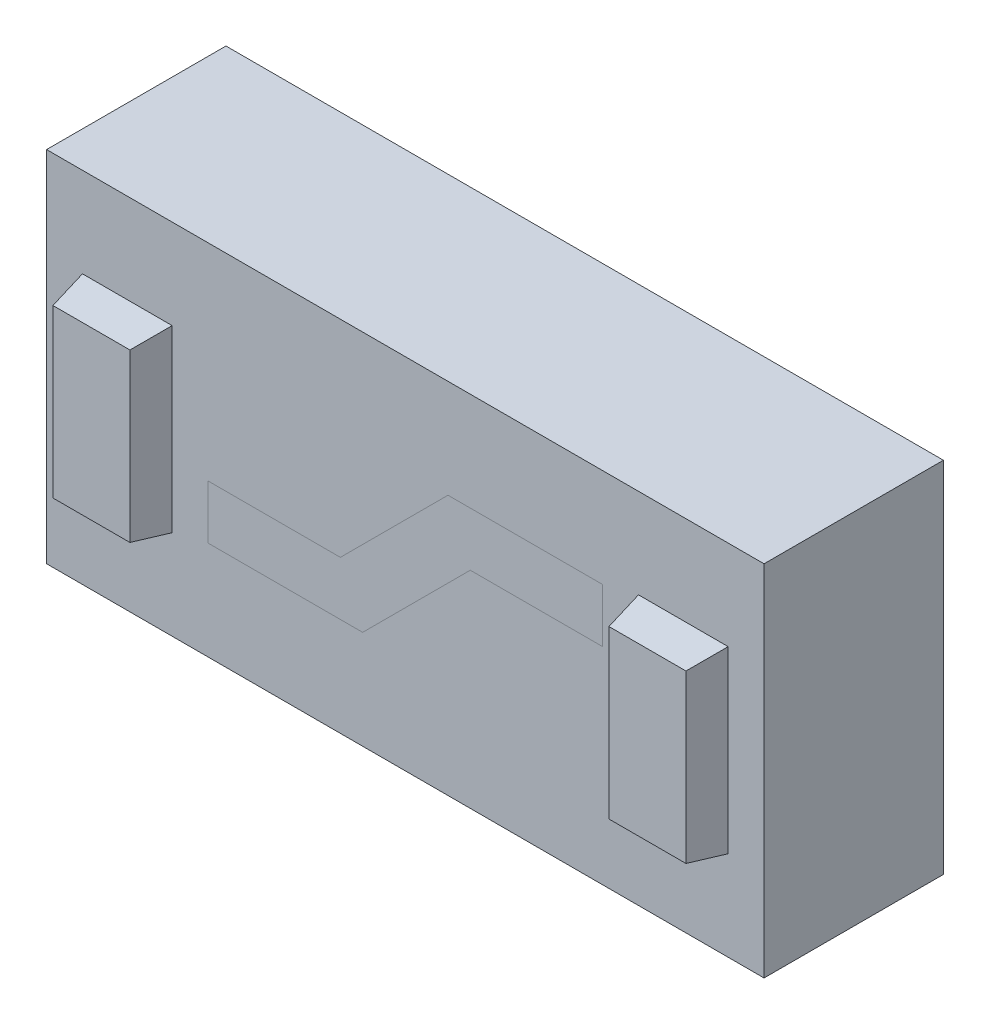
ISO-10303-21;
HEADER;
FILE_DESCRIPTION(('STEP AP214'),'2;1');
FILE_NAME('part.step','',(''),(''),'','','');
FILE_SCHEMA(('AUTOMOTIVE_DESIGN { 1 0 10303 214 1 1 1 1 }'));
ENDSEC;
DATA;
#1=APPLICATION_CONTEXT('core data for automotive mechanical design processes');
#2=APPLICATION_PROTOCOL_DEFINITION('international standard','automotive_design',2000,#1);
#3=PRODUCT_CONTEXT('',#1,'mechanical');
#4=PRODUCT('Part','Part','',(#3));
#5=PRODUCT_RELATED_PRODUCT_CATEGORY('part','',(#4));
#6=PRODUCT_DEFINITION_FORMATION('','',#4);
#7=PRODUCT_DEFINITION_CONTEXT('part definition',#1,'design');
#8=PRODUCT_DEFINITION('design','',#6,#7);
#9=PRODUCT_DEFINITION_SHAPE('','',#8);
#10=(LENGTH_UNIT() NAMED_UNIT(*) SI_UNIT(.MILLI.,.METRE.));
#11=(NAMED_UNIT(*) PLANE_ANGLE_UNIT() SI_UNIT($,.RADIAN.));
#12=(NAMED_UNIT(*) SI_UNIT($,.STERADIAN.) SOLID_ANGLE_UNIT());
#13=UNCERTAINTY_MEASURE_WITH_UNIT(LENGTH_MEASURE(1.E-05),#10,'distance_accuracy_value','');
#14=(GEOMETRIC_REPRESENTATION_CONTEXT(3) GLOBAL_UNCERTAINTY_ASSIGNED_CONTEXT((#13)) GLOBAL_UNIT_ASSIGNED_CONTEXT((#10,
#11,#12)) REPRESENTATION_CONTEXT('',''));
#15=CARTESIAN_POINT('',(0.,0.,0.));
#16=DIRECTION('',(0.,0.,1.));
#17=DIRECTION('',(1.,0.,0.));
#18=AXIS2_PLACEMENT_3D('',#15,#16,#17);
#19=CARTESIAN_POINT('',(18.,-5.,10.));
#20=DIRECTION('',(0.984807753012208,0.,0.17364817766693));
#21=DIRECTION('',(0.17364817766693,0.,-0.984807753012208));
#22=AXIS2_PLACEMENT_3D('',#19,#20,#21);
#23=PLANE('',#22);
#24=DIRECTION('',(0.,1.,0.));
#25=VECTOR('',#24,1.);
#26=CARTESIAN_POINT('',(18.,-5.,10.));
#27=LINE('',#26,#25);
#28=CARTESIAN_POINT('',(18.,-5.,10.));
#29=VERTEX_POINT('',#28);
#30=CARTESIAN_POINT('',(18.,5.,10.));
#31=VERTEX_POINT('',#30);
#32=EDGE_CURVE('E12',#29,#31,#27,.T.);
#33=ORIENTED_EDGE('',*,*,#32,.T.);
#34=DIRECTION('',(0.171087869746036,0.171087869746036,-0.970287525247814));
#35=VECTOR('',#34,1.);
#36=CARTESIAN_POINT('',(17.8536447041288,4.85364470412882,10.830022128679));
#37=LINE('',#36,#35);
#38=CARTESIAN_POINT('',(17.6473460385831,4.64734603858307,12.));
#39=VERTEX_POINT('',#38);
#40=EDGE_CURVE('E115',#39,#31,#37,.T.);
#41=ORIENTED_EDGE('',*,*,#40,.F.);
#42=DIRECTION('',(0.,-1.,0.));
#43=VECTOR('',#42,1.);
#44=CARTESIAN_POINT('',(17.6473460385831,0.,12.));
#45=LINE('',#44,#43);
#46=CARTESIAN_POINT('',(17.6473460385831,-4.64734603858307,12.));
#47=VERTEX_POINT('',#46);
#48=EDGE_CURVE('E99',#47,#39,#45,.F.);
#49=ORIENTED_EDGE('',*,*,#48,.F.);
#50=DIRECTION('',(0.171087869746036,-0.171087869746036,-0.970287525247814));
#51=VECTOR('',#50,1.);
#52=CARTESIAN_POINT('',(18.,-5.,10.));
#53=LINE('',#52,#51);
#54=EDGE_CURVE('E106',#47,#29,#53,.T.);
#55=ORIENTED_EDGE('',*,*,#54,.T.);
#56=EDGE_LOOP('',(#33,#41,#49,#55));
#57=FACE_BOUND('',#56,.T.);
#58=ADVANCED_FACE('F56',(#57),#23,.T.);
#59=CARTESIAN_POINT('',(13.,5.,10.));
#60=DIRECTION('',(0.,0.984807753012208,0.17364817766693));
#61=DIRECTION('',(0.,-0.17364817766693,0.984807753012208));
#62=AXIS2_PLACEMENT_3D('',#59,#60,#61);
#63=PLANE('',#62);
#64=DIRECTION('',(-1.,0.,0.));
#65=VECTOR('',#64,1.);
#66=CARTESIAN_POINT('',(13.,5.,10.));
#67=LINE('',#66,#65);
#68=CARTESIAN_POINT('',(13.,5.,10.));
#69=VERTEX_POINT('',#68);
#70=EDGE_CURVE('E64',#31,#69,#67,.T.);
#71=ORIENTED_EDGE('',*,*,#70,.T.);
#72=DIRECTION('',(-0.171087869746036,0.171087869746036,-0.970287525247814));
#73=VECTOR('',#72,1.);
#74=CARTESIAN_POINT('',(13.2927105917424,4.70728940825764,11.660044257358));
#75=LINE('',#74,#73);
#76=CARTESIAN_POINT('',(13.3526539614169,4.64734603858307,12.));
#77=VERTEX_POINT('',#76);
#78=EDGE_CURVE('E123',#77,#69,#75,.T.);
#79=ORIENTED_EDGE('',*,*,#78,.F.);
#80=DIRECTION('',(1.,0.,0.));
#81=VECTOR('',#80,1.);
#82=CARTESIAN_POINT('',(0.,4.64734603858307,12.));
#83=LINE('',#82,#81);
#84=EDGE_CURVE('E116',#39,#77,#83,.F.);
#85=ORIENTED_EDGE('',*,*,#84,.F.);
#86=ORIENTED_EDGE('',*,*,#40,.T.);
#87=EDGE_LOOP('',(#71,#79,#85,#86));
#88=FACE_BOUND('',#87,.T.);
#89=ADVANCED_FACE('F136',(#88),#63,.T.);
#90=CARTESIAN_POINT('',(13.,-5.,10.));
#91=DIRECTION('',(-0.984807753012208,0.,0.17364817766693));
#92=DIRECTION('',(0.17364817766693,0.,0.984807753012208));
#93=AXIS2_PLACEMENT_3D('',#90,#91,#92);
#94=PLANE('',#93);
#95=DIRECTION('',(0.,-1.,0.));
#96=VECTOR('',#95,1.);
#97=CARTESIAN_POINT('',(13.,-5.,10.));
#98=LINE('',#97,#96);
#99=CARTESIAN_POINT('',(13.,-5.,10.));
#100=VERTEX_POINT('',#99);
#101=EDGE_CURVE('E118',#69,#100,#98,.T.);
#102=ORIENTED_EDGE('',*,*,#101,.T.);
#103=DIRECTION('',(-0.171087869746036,-0.171087869746036,-0.970287525247814));
#104=VECTOR('',#103,1.);
#105=CARTESIAN_POINT('',(13.,-5.,10.));
#106=LINE('',#105,#104);
#107=CARTESIAN_POINT('',(13.3526539614169,-4.64734603858307,12.));
#108=VERTEX_POINT('',#107);
#109=EDGE_CURVE('E113',#108,#100,#106,.T.);
#110=ORIENTED_EDGE('',*,*,#109,.F.);
#111=DIRECTION('',(0.,1.,0.));
#112=VECTOR('',#111,1.);
#113=CARTESIAN_POINT('',(13.3526539614169,0.,12.));
#114=LINE('',#113,#112);
#115=EDGE_CURVE('E102',#77,#108,#114,.F.);
#116=ORIENTED_EDGE('',*,*,#115,.F.);
#117=ORIENTED_EDGE('',*,*,#78,.T.);
#118=EDGE_LOOP('',(#102,#110,#116,#117));
#119=FACE_BOUND('',#118,.T.);
#120=ADVANCED_FACE('F128',(#119),#94,.T.);
#121=CARTESIAN_POINT('',(13.,-5.,10.));
#122=DIRECTION('',(0.,-0.984807753012208,0.17364817766693));
#123=DIRECTION('',(0.,-0.17364817766693,-0.984807753012208));
#124=AXIS2_PLACEMENT_3D('',#121,#122,#123);
#125=PLANE('',#124);
#126=DIRECTION('',(1.,0.,0.));
#127=VECTOR('',#126,1.);
#128=CARTESIAN_POINT('',(13.,-5.,10.));
#129=LINE('',#128,#127);
#130=EDGE_CURVE('E111',#100,#29,#129,.T.);
#131=ORIENTED_EDGE('',*,*,#130,.T.);
#132=ORIENTED_EDGE('',*,*,#54,.F.);
#133=DIRECTION('',(-1.,0.,0.));
#134=VECTOR('',#133,1.);
#135=CARTESIAN_POINT('',(0.,-4.64734603858307,12.));
#136=LINE('',#135,#134);
#137=EDGE_CURVE('E96',#108,#47,#136,.F.);
#138=ORIENTED_EDGE('',*,*,#137,.F.);
#139=ORIENTED_EDGE('',*,*,#109,.T.);
#140=EDGE_LOOP('',(#131,#132,#138,#139));
#141=FACE_BOUND('',#140,.T.);
#142=ADVANCED_FACE('F109',(#141),#125,.T.);
#143=CARTESIAN_POINT('',(0.,0.,12.));
#144=DIRECTION('',(0.,0.,-1.));
#145=DIRECTION('',(-1.,0.,0.));
#146=AXIS2_PLACEMENT_3D('',#143,#144,#145);
#147=PLANE('',#146);
#148=ORIENTED_EDGE('',*,*,#48,.T.);
#149=ORIENTED_EDGE('',*,*,#84,.T.);
#150=ORIENTED_EDGE('',*,*,#115,.T.);
#151=ORIENTED_EDGE('',*,*,#137,.T.);
#152=EDGE_LOOP('',(#148,#149,#150,#151));
#153=FACE_BOUND('',#152,.T.);
#154=ADVANCED_FACE('F58',(#153),#147,.F.);
#155=CARTESIAN_POINT('',(0.,0.,10.));
#156=DIRECTION('',(0.,0.,-1.));
#157=DIRECTION('',(-1.,0.,0.));
#158=AXIS2_PLACEMENT_3D('',#155,#156,#157);
#159=PLANE('',#158);
#160=ORIENTED_EDGE('',*,*,#32,.F.);
#161=ORIENTED_EDGE('',*,*,#130,.F.);
#162=ORIENTED_EDGE('',*,*,#101,.F.);
#163=ORIENTED_EDGE('',*,*,#70,.F.);
#164=EDGE_LOOP('',(#160,#161,#162,#163));
#165=FACE_BOUND('',#164,.T.);
#166=ADVANCED_FACE('F129',(#165),#159,.T.);
#167=CLOSED_SHELL('',(#58,#89,#120,#142,#154,#166));
#168=MANIFOLD_SOLID_BREP('B2',#167);
#169=CARTESIAN_POINT('',(-13.,-5.,10.));
#170=DIRECTION('',(0.984807753012208,0.,0.17364817766693));
#171=DIRECTION('',(0.17364817766693,0.,-0.984807753012208));
#172=AXIS2_PLACEMENT_3D('',#169,#170,#171);
#173=PLANE('',#172);
#174=DIRECTION('',(0.,1.,0.));
#175=VECTOR('',#174,1.);
#176=CARTESIAN_POINT('',(-13.,-5.,10.));
#177=LINE('',#176,#175);
#178=CARTESIAN_POINT('',(-13.,-5.,10.));
#179=VERTEX_POINT('',#178);
#180=CARTESIAN_POINT('',(-13.,5.,10.));
#181=VERTEX_POINT('',#180);
#182=EDGE_CURVE('E248',#179,#181,#177,.T.);
#183=ORIENTED_EDGE('',*,*,#182,.T.);
#184=DIRECTION('',(0.171087869746036,0.171087869746036,-0.970287525247814));
#185=VECTOR('',#184,1.);
#186=CARTESIAN_POINT('',(-13.1463552958712,4.85364470412882,10.830022128679));
#187=LINE('',#186,#185);
#188=CARTESIAN_POINT('',(-13.3526539614169,4.64734603858307,12.));
#189=VERTEX_POINT('',#188);
#190=EDGE_CURVE('E54',#189,#181,#187,.T.);
#191=ORIENTED_EDGE('',*,*,#190,.F.);
#192=DIRECTION('',(0.,-1.,0.));
#193=VECTOR('',#192,1.);
#194=CARTESIAN_POINT('',(-13.3526539614169,0.,12.));
#195=LINE('',#194,#193);
#196=CARTESIAN_POINT('',(-13.3526539614169,-4.64734603858307,12.));
#197=VERTEX_POINT('',#196);
#198=EDGE_CURVE('E264',#197,#189,#195,.F.);
#199=ORIENTED_EDGE('',*,*,#198,.F.);
#200=DIRECTION('',(0.171087869746036,-0.171087869746036,-0.970287525247814));
#201=VECTOR('',#200,1.);
#202=CARTESIAN_POINT('',(-13.,-5.,10.));
#203=LINE('',#202,#201);
#204=EDGE_CURVE('E259',#197,#179,#203,.T.);
#205=ORIENTED_EDGE('',*,*,#204,.T.);
#206=EDGE_LOOP('',(#183,#191,#199,#205));
#207=FACE_BOUND('',#206,.T.);
#208=ADVANCED_FACE('F202',(#207),#173,.T.);
#209=CARTESIAN_POINT('',(-18.,5.,10.));
#210=DIRECTION('',(0.,0.984807753012208,0.17364817766693));
#211=DIRECTION('',(0.,-0.17364817766693,0.984807753012208));
#212=AXIS2_PLACEMENT_3D('',#209,#210,#211);
#213=PLANE('',#212);
#214=DIRECTION('',(-1.,0.,0.));
#215=VECTOR('',#214,1.);
#216=CARTESIAN_POINT('',(-18.,5.,10.));
#217=LINE('',#216,#215);
#218=CARTESIAN_POINT('',(-18.,5.,10.));
#219=VERTEX_POINT('',#218);
#220=EDGE_CURVE('E244',#181,#219,#217,.T.);
#221=ORIENTED_EDGE('',*,*,#220,.T.);
#222=DIRECTION('',(-0.171087869746036,0.171087869746036,-0.970287525247814));
#223=VECTOR('',#222,1.);
#224=CARTESIAN_POINT('',(-17.7072894082576,4.70728940825764,11.660044257358));
#225=LINE('',#224,#223);
#226=CARTESIAN_POINT('',(-17.6473460385831,4.64734603858307,12.));
#227=VERTEX_POINT('',#226);
#228=EDGE_CURVE('E211',#227,#219,#225,.T.);
#229=ORIENTED_EDGE('',*,*,#228,.F.);
#230=DIRECTION('',(1.,0.,0.));
#231=VECTOR('',#230,1.);
#232=CARTESIAN_POINT('',(0.,4.64734603858307,12.));
#233=LINE('',#232,#231);
#234=EDGE_CURVE('E255',#189,#227,#233,.F.);
#235=ORIENTED_EDGE('',*,*,#234,.F.);
#236=ORIENTED_EDGE('',*,*,#190,.T.);
#237=EDGE_LOOP('',(#221,#229,#235,#236));
#238=FACE_BOUND('',#237,.T.);
#239=ADVANCED_FACE('F204',(#238),#213,.T.);
#240=CARTESIAN_POINT('',(-18.,-5.,10.));
#241=DIRECTION('',(-0.984807753012208,0.,0.17364817766693));
#242=DIRECTION('',(0.17364817766693,0.,0.984807753012208));
#243=AXIS2_PLACEMENT_3D('',#240,#241,#242);
#244=PLANE('',#243);
#245=DIRECTION('',(0.,-1.,0.));
#246=VECTOR('',#245,1.);
#247=CARTESIAN_POINT('',(-18.,-5.,10.));
#248=LINE('',#247,#246);
#249=CARTESIAN_POINT('',(-18.,-5.,10.));
#250=VERTEX_POINT('',#249);
#251=EDGE_CURVE('E249',#219,#250,#248,.T.);
#252=ORIENTED_EDGE('',*,*,#251,.T.);
#253=DIRECTION('',(-0.171087869746036,-0.171087869746036,-0.970287525247814));
#254=VECTOR('',#253,1.);
#255=CARTESIAN_POINT('',(-18.,-5.,10.));
#256=LINE('',#255,#254);
#257=CARTESIAN_POINT('',(-17.6473460385831,-4.64734603858307,12.));
#258=VERTEX_POINT('',#257);
#259=EDGE_CURVE('E267',#258,#250,#256,.T.);
#260=ORIENTED_EDGE('',*,*,#259,.F.);
#261=DIRECTION('',(0.,1.,0.));
#262=VECTOR('',#261,1.);
#263=CARTESIAN_POINT('',(-17.6473460385831,0.,12.));
#264=LINE('',#263,#262);
#265=EDGE_CURVE('E223',#227,#258,#264,.F.);
#266=ORIENTED_EDGE('',*,*,#265,.F.);
#267=ORIENTED_EDGE('',*,*,#228,.T.);
#268=EDGE_LOOP('',(#252,#260,#266,#267));
#269=FACE_BOUND('',#268,.T.);
#270=ADVANCED_FACE('F274',(#269),#244,.T.);
#271=CARTESIAN_POINT('',(-18.,-5.,10.));
#272=DIRECTION('',(0.,-0.984807753012208,0.17364817766693));
#273=DIRECTION('',(0.,-0.17364817766693,-0.984807753012208));
#274=AXIS2_PLACEMENT_3D('',#271,#272,#273);
#275=PLANE('',#274);
#276=DIRECTION('',(1.,0.,0.));
#277=VECTOR('',#276,1.);
#278=CARTESIAN_POINT('',(-18.,-5.,10.));
#279=LINE('',#278,#277);
#280=EDGE_CURVE('E263',#250,#179,#279,.T.);
#281=ORIENTED_EDGE('',*,*,#280,.T.);
#282=ORIENTED_EDGE('',*,*,#204,.F.);
#283=DIRECTION('',(-1.,0.,0.));
#284=VECTOR('',#283,1.);
#285=CARTESIAN_POINT('',(0.,-4.64734603858307,12.));
#286=LINE('',#285,#284);
#287=EDGE_CURVE('E206',#258,#197,#286,.F.);
#288=ORIENTED_EDGE('',*,*,#287,.F.);
#289=ORIENTED_EDGE('',*,*,#259,.T.);
#290=EDGE_LOOP('',(#281,#282,#288,#289));
#291=FACE_BOUND('',#290,.T.);
#292=ADVANCED_FACE('F276',(#291),#275,.T.);
#293=CARTESIAN_POINT('',(0.,0.,12.));
#294=DIRECTION('',(0.,0.,-1.));
#295=DIRECTION('',(-1.,0.,0.));
#296=AXIS2_PLACEMENT_3D('',#293,#294,#295);
#297=PLANE('',#296);
#298=ORIENTED_EDGE('',*,*,#198,.T.);
#299=ORIENTED_EDGE('',*,*,#234,.T.);
#300=ORIENTED_EDGE('',*,*,#265,.T.);
#301=ORIENTED_EDGE('',*,*,#287,.T.);
#302=EDGE_LOOP('',(#298,#299,#300,#301));
#303=FACE_BOUND('',#302,.T.);
#304=ADVANCED_FACE('F272',(#303),#297,.F.);
#305=CARTESIAN_POINT('',(0.,0.,10.));
#306=DIRECTION('',(0.,0.,-1.));
#307=DIRECTION('',(-1.,0.,0.));
#308=AXIS2_PLACEMENT_3D('',#305,#306,#307);
#309=PLANE('',#308);
#310=ORIENTED_EDGE('',*,*,#182,.F.);
#311=ORIENTED_EDGE('',*,*,#280,.F.);
#312=ORIENTED_EDGE('',*,*,#251,.F.);
#313=ORIENTED_EDGE('',*,*,#220,.F.);
#314=EDGE_LOOP('',(#310,#311,#312,#313));
#315=FACE_BOUND('',#314,.T.);
#316=ADVANCED_FACE('F245',(#315),#309,.T.);
#317=CLOSED_SHELL('',(#208,#239,#270,#292,#304,#316));
#318=MANIFOLD_SOLID_BREP('B6',#317);
#319=CARTESIAN_POINT('',(-11.,-1.5,8.8));
#320=DIRECTION('',(0.,1.,0.));
#321=DIRECTION('',(0.,0.,1.));
#322=AXIS2_PLACEMENT_3D('',#319,#320,#321);
#323=PLANE('',#322);
#324=DIRECTION('',(-1.,0.,0.));
#325=VECTOR('',#324,1.);
#326=CARTESIAN_POINT('',(-11.,-1.5,10.));
#327=LINE('',#326,#325);
#328=CARTESIAN_POINT('',(-3.62132034355964,-1.5,10.));
#329=VERTEX_POINT('',#328);
#330=CARTESIAN_POINT('',(-11.,-1.5,10.));
#331=VERTEX_POINT('',#330);
#332=EDGE_CURVE('E444',#329,#331,#327,.T.);
#333=ORIENTED_EDGE('',*,*,#332,.F.);
#334=DIRECTION('',(0.,0.,1.));
#335=VECTOR('',#334,1.);
#336=CARTESIAN_POINT('',(-3.62132034355964,-1.5,8.8));
#337=LINE('',#336,#335);
#338=CARTESIAN_POINT('',(-3.62132034355964,-1.5,8.8));
#339=VERTEX_POINT('',#338);
#340=EDGE_CURVE('E200',#339,#329,#337,.T.);
#341=ORIENTED_EDGE('',*,*,#340,.F.);
#342=DIRECTION('',(-1.,0.,0.));
#343=VECTOR('',#342,1.);
#344=CARTESIAN_POINT('',(-11.,-1.5,8.8));
#345=LINE('',#344,#343);
#346=CARTESIAN_POINT('',(-11.,-1.5,8.8));
#347=VERTEX_POINT('',#346);
#348=EDGE_CURVE('E464',#339,#347,#345,.T.);
#349=ORIENTED_EDGE('',*,*,#348,.T.);
#350=DIRECTION('',(0.,0.,1.));
#351=VECTOR('',#350,1.);
#352=CARTESIAN_POINT('',(-11.,-1.5,8.8));
#353=LINE('',#352,#351);
#354=EDGE_CURVE('E350',#347,#331,#353,.T.);
#355=ORIENTED_EDGE('',*,*,#354,.T.);
#356=EDGE_LOOP('',(#333,#341,#349,#355));
#357=FACE_BOUND('',#356,.T.);
#358=ADVANCED_FACE('F347',(#357),#323,.T.);
#359=CARTESIAN_POINT('',(-3.62132034355964,-1.5,8.8));
#360=DIRECTION('',(-0.707106781186548,0.707106781186548,0.));
#361=DIRECTION('',(-0.707106781186548,-0.707106781186548,0.));
#362=AXIS2_PLACEMENT_3D('',#359,#360,#361);
#363=PLANE('',#362);
#364=DIRECTION('',(-0.707106781186548,-0.707106781186548,0.));
#365=VECTOR('',#364,1.);
#366=CARTESIAN_POINT('',(-3.62132034355964,-1.5,10.));
#367=LINE('',#366,#365);
#368=CARTESIAN_POINT('',(2.37867965644036,4.5,10.));
#369=VERTEX_POINT('',#368);
#370=EDGE_CURVE('E462',#369,#329,#367,.T.);
#371=ORIENTED_EDGE('',*,*,#370,.F.);
#372=DIRECTION('',(0.,0.,1.));
#373=VECTOR('',#372,1.);
#374=CARTESIAN_POINT('',(2.37867965644036,4.5,8.8));
#375=LINE('',#374,#373);
#376=CARTESIAN_POINT('',(2.37867965644036,4.5,8.8));
#377=VERTEX_POINT('',#376);
#378=EDGE_CURVE('E356',#377,#369,#375,.T.);
#379=ORIENTED_EDGE('',*,*,#378,.F.);
#380=DIRECTION('',(-0.707106781186548,-0.707106781186548,0.));
#381=VECTOR('',#380,1.);
#382=CARTESIAN_POINT('',(-3.62132034355964,-1.5,8.8));
#383=LINE('',#382,#381);
#384=EDGE_CURVE('E434',#377,#339,#383,.T.);
#385=ORIENTED_EDGE('',*,*,#384,.T.);
#386=ORIENTED_EDGE('',*,*,#340,.T.);
#387=EDGE_LOOP('',(#371,#379,#385,#386));
#388=FACE_BOUND('',#387,.T.);
#389=ADVANCED_FACE('F476',(#388),#363,.T.);
#390=CARTESIAN_POINT('',(2.37867965644036,4.5,8.8));
#391=DIRECTION('',(0.,1.,0.));
#392=DIRECTION('',(0.,0.,1.));
#393=AXIS2_PLACEMENT_3D('',#390,#391,#392);
#394=PLANE('',#393);
#395=DIRECTION('',(-1.,0.,0.));
#396=VECTOR('',#395,1.);
#397=CARTESIAN_POINT('',(2.37867965644036,4.5,10.));
#398=LINE('',#397,#396);
#399=CARTESIAN_POINT('',(11.,4.5,10.));
#400=VERTEX_POINT('',#399);
#401=EDGE_CURVE('E421',#400,#369,#398,.T.);
#402=ORIENTED_EDGE('',*,*,#401,.F.);
#403=DIRECTION('',(0.,0.,1.));
#404=VECTOR('',#403,1.);
#405=CARTESIAN_POINT('',(11.,4.5,8.8));
#406=LINE('',#405,#404);
#407=CARTESIAN_POINT('',(11.,4.5,8.8));
#408=VERTEX_POINT('',#407);
#409=EDGE_CURVE('E416',#408,#400,#406,.T.);
#410=ORIENTED_EDGE('',*,*,#409,.F.);
#411=DIRECTION('',(-1.,0.,0.));
#412=VECTOR('',#411,1.);
#413=CARTESIAN_POINT('',(2.37867965644036,4.5,8.8));
#414=LINE('',#413,#412);
#415=EDGE_CURVE('E419',#408,#377,#414,.T.);
#416=ORIENTED_EDGE('',*,*,#415,.T.);
#417=ORIENTED_EDGE('',*,*,#378,.T.);
#418=EDGE_LOOP('',(#402,#410,#416,#417));
#419=FACE_BOUND('',#418,.T.);
#420=ADVANCED_FACE('F418',(#419),#394,.T.);
#421=CARTESIAN_POINT('',(11.,4.5,8.8));
#422=DIRECTION('',(1.,0.,0.));
#423=DIRECTION('',(0.,0.,-1.));
#424=AXIS2_PLACEMENT_3D('',#421,#422,#423);
#425=PLANE('',#424);
#426=DIRECTION('',(0.,1.,0.));
#427=VECTOR('',#426,1.);
#428=CARTESIAN_POINT('',(11.,4.5,10.));
#429=LINE('',#428,#427);
#430=CARTESIAN_POINT('',(11.,1.5,10.));
#431=VERTEX_POINT('',#430);
#432=EDGE_CURVE('E459',#431,#400,#429,.T.);
#433=ORIENTED_EDGE('',*,*,#432,.F.);
#434=DIRECTION('',(0.,0.,1.));
#435=VECTOR('',#434,1.);
#436=CARTESIAN_POINT('',(11.,1.5,8.8));
#437=LINE('',#436,#435);
#438=CARTESIAN_POINT('',(11.,1.5,8.8));
#439=VERTEX_POINT('',#438);
#440=EDGE_CURVE('E426',#439,#431,#437,.T.);
#441=ORIENTED_EDGE('',*,*,#440,.F.);
#442=DIRECTION('',(0.,1.,0.));
#443=VECTOR('',#442,1.);
#444=CARTESIAN_POINT('',(11.,4.5,8.8));
#445=LINE('',#444,#443);
#446=EDGE_CURVE('E432',#439,#408,#445,.T.);
#447=ORIENTED_EDGE('',*,*,#446,.T.);
#448=ORIENTED_EDGE('',*,*,#409,.T.);
#449=EDGE_LOOP('',(#433,#441,#447,#448));
#450=FACE_BOUND('',#449,.T.);
#451=ADVANCED_FACE('F436',(#450),#425,.T.);
#452=CARTESIAN_POINT('',(11.,1.5,8.8));
#453=DIRECTION('',(0.,-1.,0.));
#454=DIRECTION('',(0.,0.,-1.));
#455=AXIS2_PLACEMENT_3D('',#452,#453,#454);
#456=PLANE('',#455);
#457=DIRECTION('',(1.,0.,0.));
#458=VECTOR('',#457,1.);
#459=CARTESIAN_POINT('',(11.,1.5,10.));
#460=LINE('',#459,#458);
#461=CARTESIAN_POINT('',(3.62132034355964,1.5,10.));
#462=VERTEX_POINT('',#461);
#463=EDGE_CURVE('E456',#462,#431,#460,.T.);
#464=ORIENTED_EDGE('',*,*,#463,.F.);
#465=DIRECTION('',(0.,0.,1.));
#466=VECTOR('',#465,1.);
#467=CARTESIAN_POINT('',(3.62132034355964,1.5,8.8));
#468=LINE('',#467,#466);
#469=CARTESIAN_POINT('',(3.62132034355964,1.5,8.8));
#470=VERTEX_POINT('',#469);
#471=EDGE_CURVE('E468',#470,#462,#468,.T.);
#472=ORIENTED_EDGE('',*,*,#471,.F.);
#473=DIRECTION('',(1.,0.,0.));
#474=VECTOR('',#473,1.);
#475=CARTESIAN_POINT('',(11.,1.5,8.8));
#476=LINE('',#475,#474);
#477=EDGE_CURVE('E437',#470,#439,#476,.T.);
#478=ORIENTED_EDGE('',*,*,#477,.T.);
#479=ORIENTED_EDGE('',*,*,#440,.T.);
#480=EDGE_LOOP('',(#464,#472,#478,#479));
#481=FACE_BOUND('',#480,.T.);
#482=ADVANCED_FACE('F489',(#481),#456,.T.);
#483=CARTESIAN_POINT('',(3.62132034355964,1.5,8.8));
#484=DIRECTION('',(0.707106781186548,-0.707106781186548,0.));
#485=DIRECTION('',(0.707106781186548,0.707106781186548,0.));
#486=AXIS2_PLACEMENT_3D('',#483,#484,#485);
#487=PLANE('',#486);
#488=DIRECTION('',(0.707106781186548,0.707106781186548,0.));
#489=VECTOR('',#488,1.);
#490=CARTESIAN_POINT('',(3.62132034355964,1.5,10.));
#491=LINE('',#490,#489);
#492=CARTESIAN_POINT('',(-2.37867965644036,-4.5,10.));
#493=VERTEX_POINT('',#492);
#494=EDGE_CURVE('E453',#493,#462,#491,.T.);
#495=ORIENTED_EDGE('',*,*,#494,.F.);
#496=DIRECTION('',(0.,0.,1.));
#497=VECTOR('',#496,1.);
#498=CARTESIAN_POINT('',(-2.37867965644036,-4.5,8.8));
#499=LINE('',#498,#497);
#500=CARTESIAN_POINT('',(-2.37867965644036,-4.5,8.8));
#501=VERTEX_POINT('',#500);
#502=EDGE_CURVE('E470',#501,#493,#499,.T.);
#503=ORIENTED_EDGE('',*,*,#502,.F.);
#504=DIRECTION('',(0.707106781186548,0.707106781186548,0.));
#505=VECTOR('',#504,1.);
#506=CARTESIAN_POINT('',(3.62132034355964,1.5,8.8));
#507=LINE('',#506,#505);
#508=EDGE_CURVE('E439',#501,#470,#507,.T.);
#509=ORIENTED_EDGE('',*,*,#508,.T.);
#510=ORIENTED_EDGE('',*,*,#471,.T.);
#511=EDGE_LOOP('',(#495,#503,#509,#510));
#512=FACE_BOUND('',#511,.T.);
#513=ADVANCED_FACE('F492',(#512),#487,.T.);
#514=CARTESIAN_POINT('',(-2.37867965644036,-4.5,8.8));
#515=DIRECTION('',(0.,-1.,0.));
#516=DIRECTION('',(0.,0.,-1.));
#517=AXIS2_PLACEMENT_3D('',#514,#515,#516);
#518=PLANE('',#517);
#519=DIRECTION('',(1.,0.,0.));
#520=VECTOR('',#519,1.);
#521=CARTESIAN_POINT('',(-2.37867965644036,-4.5,10.));
#522=LINE('',#521,#520);
#523=CARTESIAN_POINT('',(-11.,-4.5,10.));
#524=VERTEX_POINT('',#523);
#525=EDGE_CURVE('E450',#524,#493,#522,.T.);
#526=ORIENTED_EDGE('',*,*,#525,.F.);
#527=DIRECTION('',(0.,0.,1.));
#528=VECTOR('',#527,1.);
#529=CARTESIAN_POINT('',(-11.,-4.5,8.8));
#530=LINE('',#529,#528);
#531=CARTESIAN_POINT('',(-11.,-4.5,8.8));
#532=VERTEX_POINT('',#531);
#533=EDGE_CURVE('E471',#532,#524,#530,.T.);
#534=ORIENTED_EDGE('',*,*,#533,.F.);
#535=DIRECTION('',(1.,0.,0.));
#536=VECTOR('',#535,1.);
#537=CARTESIAN_POINT('',(-2.37867965644036,-4.5,8.8));
#538=LINE('',#537,#536);
#539=EDGE_CURVE('E587',#532,#501,#538,.T.);
#540=ORIENTED_EDGE('',*,*,#539,.T.);
#541=ORIENTED_EDGE('',*,*,#502,.T.);
#542=EDGE_LOOP('',(#526,#534,#540,#541));
#543=FACE_BOUND('',#542,.T.);
#544=ADVANCED_FACE('F496',(#543),#518,.T.);
#545=CARTESIAN_POINT('',(-11.,-4.5,8.8));
#546=DIRECTION('',(-1.,0.,0.));
#547=DIRECTION('',(0.,0.,1.));
#548=AXIS2_PLACEMENT_3D('',#545,#546,#547);
#549=PLANE('',#548);
#550=DIRECTION('',(0.,-1.,0.));
#551=VECTOR('',#550,1.);
#552=CARTESIAN_POINT('',(-11.,-4.5,10.));
#553=LINE('',#552,#551);
#554=EDGE_CURVE('E447',#331,#524,#553,.T.);
#555=ORIENTED_EDGE('',*,*,#554,.F.);
#556=ORIENTED_EDGE('',*,*,#354,.F.);
#557=DIRECTION('',(0.,-1.,0.));
#558=VECTOR('',#557,1.);
#559=CARTESIAN_POINT('',(-11.,-4.5,8.8));
#560=LINE('',#559,#558);
#561=EDGE_CURVE('E588',#347,#532,#560,.T.);
#562=ORIENTED_EDGE('',*,*,#561,.T.);
#563=ORIENTED_EDGE('',*,*,#533,.T.);
#564=EDGE_LOOP('',(#555,#556,#562,#563));
#565=FACE_BOUND('',#564,.T.);
#566=ADVANCED_FACE('F473',(#565),#549,.T.);
#567=CARTESIAN_POINT('',(0.,0.,8.8));
#568=DIRECTION('',(0.,0.,-1.));
#569=DIRECTION('',(-1.,0.,0.));
#570=AXIS2_PLACEMENT_3D('',#567,#568,#569);
#571=PLANE('',#570);
#572=ORIENTED_EDGE('',*,*,#348,.F.);
#573=ORIENTED_EDGE('',*,*,#384,.F.);
#574=ORIENTED_EDGE('',*,*,#415,.F.);
#575=ORIENTED_EDGE('',*,*,#446,.F.);
#576=ORIENTED_EDGE('',*,*,#477,.F.);
#577=ORIENTED_EDGE('',*,*,#508,.F.);
#578=ORIENTED_EDGE('',*,*,#539,.F.);
#579=ORIENTED_EDGE('',*,*,#561,.F.);
#580=EDGE_LOOP('',(#572,#573,#574,#575,#576,#577,#578,#579));
#581=FACE_BOUND('',#580,.T.);
#582=ADVANCED_FACE('F430',(#581),#571,.T.);
#583=CARTESIAN_POINT('',(0.,0.,10.));
#584=DIRECTION('',(0.,0.,-1.));
#585=DIRECTION('',(-1.,0.,0.));
#586=AXIS2_PLACEMENT_3D('',#583,#584,#585);
#587=PLANE('',#586);
#588=ORIENTED_EDGE('',*,*,#332,.T.);
#589=ORIENTED_EDGE('',*,*,#554,.T.);
#590=ORIENTED_EDGE('',*,*,#525,.T.);
#591=ORIENTED_EDGE('',*,*,#494,.T.);
#592=ORIENTED_EDGE('',*,*,#463,.T.);
#593=ORIENTED_EDGE('',*,*,#432,.T.);
#594=ORIENTED_EDGE('',*,*,#401,.T.);
#595=ORIENTED_EDGE('',*,*,#370,.T.);
#596=EDGE_LOOP('',(#588,#589,#590,#591,#592,#593,#594,#595));
#597=FACE_BOUND('',#596,.T.);
#598=ADVANCED_FACE('F475',(#597),#587,.F.);
#599=CLOSED_SHELL('',(#358,#389,#420,#451,#482,#513,#544,#566,#582,#598));
#600=MANIFOLD_SOLID_BREP('B48',#599);
#601=CARTESIAN_POINT('',(20.,-10.,10.));
#602=DIRECTION('',(-1.,0.,0.));
#603=DIRECTION('',(0.,0.,1.));
#604=AXIS2_PLACEMENT_3D('',#601,#602,#603);
#605=PLANE('',#604);
#606=DIRECTION('',(0.,1.,0.));
#607=VECTOR('',#606,1.);
#608=CARTESIAN_POINT('',(20.,-10.,0.));
#609=LINE('',#608,#607);
#610=CARTESIAN_POINT('',(20.,-10.,0.));
#611=VERTEX_POINT('',#610);
#612=CARTESIAN_POINT('',(20.,10.,0.));
#613=VERTEX_POINT('',#612);
#614=EDGE_CURVE('E751',#611,#613,#609,.T.);
#615=ORIENTED_EDGE('',*,*,#614,.T.);
#616=DIRECTION('',(0.,0.,-1.));
#617=VECTOR('',#616,1.);
#618=CARTESIAN_POINT('',(20.,10.,10.));
#619=LINE('',#618,#617);
#620=CARTESIAN_POINT('',(20.,10.,10.));
#621=VERTEX_POINT('',#620);
#622=EDGE_CURVE('E345',#621,#613,#619,.T.);
#623=ORIENTED_EDGE('',*,*,#622,.F.);
#624=DIRECTION('',(0.,1.,0.));
#625=VECTOR('',#624,1.);
#626=CARTESIAN_POINT('',(20.,-10.,10.));
#627=LINE('',#626,#625);
#628=CARTESIAN_POINT('',(20.,-10.,10.));
#629=VERTEX_POINT('',#628);
#630=EDGE_CURVE('E763',#629,#621,#627,.T.);
#631=ORIENTED_EDGE('',*,*,#630,.F.);
#632=DIRECTION('',(0.,0.,-1.));
#633=VECTOR('',#632,1.);
#634=CARTESIAN_POINT('',(20.,-10.,10.));
#635=LINE('',#634,#633);
#636=EDGE_CURVE('E769',#629,#611,#635,.T.);
#637=ORIENTED_EDGE('',*,*,#636,.T.);
#638=EDGE_LOOP('',(#615,#623,#631,#637));
#639=FACE_BOUND('',#638,.T.);
#640=ADVANCED_FACE('F595',(#639),#605,.F.);
#641=CARTESIAN_POINT('',(-20.,10.,10.));
#642=DIRECTION('',(0.,-1.,0.));
#643=DIRECTION('',(0.,0.,-1.));
#644=AXIS2_PLACEMENT_3D('',#641,#642,#643);
#645=PLANE('',#644);
#646=DIRECTION('',(-1.,0.,0.));
#647=VECTOR('',#646,1.);
#648=CARTESIAN_POINT('',(-20.,10.,0.));
#649=LINE('',#648,#647);
#650=CARTESIAN_POINT('',(-20.,10.,0.));
#651=VERTEX_POINT('',#650);
#652=EDGE_CURVE('E772',#613,#651,#649,.T.);
#653=ORIENTED_EDGE('',*,*,#652,.T.);
#654=DIRECTION('',(0.,0.,-1.));
#655=VECTOR('',#654,1.);
#656=CARTESIAN_POINT('',(-20.,10.,10.));
#657=LINE('',#656,#655);
#658=CARTESIAN_POINT('',(-20.,10.,10.));
#659=VERTEX_POINT('',#658);
#660=EDGE_CURVE('E602',#659,#651,#657,.T.);
#661=ORIENTED_EDGE('',*,*,#660,.F.);
#662=DIRECTION('',(-1.,0.,0.));
#663=VECTOR('',#662,1.);
#664=CARTESIAN_POINT('',(-20.,10.,10.));
#665=LINE('',#664,#663);
#666=EDGE_CURVE('E646',#621,#659,#665,.T.);
#667=ORIENTED_EDGE('',*,*,#666,.F.);
#668=ORIENTED_EDGE('',*,*,#622,.T.);
#669=EDGE_LOOP('',(#653,#661,#667,#668));
#670=FACE_BOUND('',#669,.T.);
#671=ADVANCED_FACE('F802',(#670),#645,.F.);
#672=CARTESIAN_POINT('',(-20.,-10.,10.));
#673=DIRECTION('',(1.,0.,0.));
#674=DIRECTION('',(0.,0.,-1.));
#675=AXIS2_PLACEMENT_3D('',#672,#673,#674);
#676=PLANE('',#675);
#677=DIRECTION('',(0.,-1.,0.));
#678=VECTOR('',#677,1.);
#679=CARTESIAN_POINT('',(-20.,-10.,0.));
#680=LINE('',#679,#678);
#681=CARTESIAN_POINT('',(-20.,-10.,0.));
#682=VERTEX_POINT('',#681);
#683=EDGE_CURVE('E774',#651,#682,#680,.T.);
#684=ORIENTED_EDGE('',*,*,#683,.T.);
#685=DIRECTION('',(0.,0.,-1.));
#686=VECTOR('',#685,1.);
#687=CARTESIAN_POINT('',(-20.,-10.,10.));
#688=LINE('',#687,#686);
#689=CARTESIAN_POINT('',(-20.,-10.,10.));
#690=VERTEX_POINT('',#689);
#691=EDGE_CURVE('E778',#690,#682,#688,.T.);
#692=ORIENTED_EDGE('',*,*,#691,.F.);
#693=DIRECTION('',(0.,-1.,0.));
#694=VECTOR('',#693,1.);
#695=CARTESIAN_POINT('',(-20.,-10.,10.));
#696=LINE('',#695,#694);
#697=EDGE_CURVE('E766',#659,#690,#696,.T.);
#698=ORIENTED_EDGE('',*,*,#697,.F.);
#699=ORIENTED_EDGE('',*,*,#660,.T.);
#700=EDGE_LOOP('',(#684,#692,#698,#699));
#701=FACE_BOUND('',#700,.T.);
#702=ADVANCED_FACE('F783',(#701),#676,.F.);
#703=CARTESIAN_POINT('',(-20.,-10.,10.));
#704=DIRECTION('',(0.,1.,0.));
#705=DIRECTION('',(0.,0.,1.));
#706=AXIS2_PLACEMENT_3D('',#703,#704,#705);
#707=PLANE('',#706);
#708=DIRECTION('',(1.,0.,0.));
#709=VECTOR('',#708,1.);
#710=CARTESIAN_POINT('',(-20.,-10.,0.));
#711=LINE('',#710,#709);
#712=EDGE_CURVE('E639',#682,#611,#711,.T.);
#713=ORIENTED_EDGE('',*,*,#712,.T.);
#714=ORIENTED_EDGE('',*,*,#636,.F.);
#715=DIRECTION('',(1.,0.,0.));
#716=VECTOR('',#715,1.);
#717=CARTESIAN_POINT('',(-20.,-10.,10.));
#718=LINE('',#717,#716);
#719=EDGE_CURVE('E618',#690,#629,#718,.T.);
#720=ORIENTED_EDGE('',*,*,#719,.F.);
#721=ORIENTED_EDGE('',*,*,#691,.T.);
#722=EDGE_LOOP('',(#713,#714,#720,#721));
#723=FACE_BOUND('',#722,.T.);
#724=ADVANCED_FACE('F791',(#723),#707,.F.);
#725=CARTESIAN_POINT('',(0.,0.,10.));
#726=DIRECTION('',(0.,0.,-1.));
#727=DIRECTION('',(-1.,0.,0.));
#728=AXIS2_PLACEMENT_3D('',#725,#726,#727);
#729=PLANE('',#728);
#730=DIRECTION('',(0.,-1.,0.));
#731=VECTOR('',#730,1.);
#732=CARTESIAN_POINT('',(-11.,-4.5,10.));
#733=LINE('',#732,#731);
#734=CARTESIAN_POINT('',(-11.,-1.5,10.));
#735=VERTEX_POINT('',#734);
#736=CARTESIAN_POINT('',(-11.,-4.5,10.));
#737=VERTEX_POINT('',#736);
#738=EDGE_CURVE('E733',#735,#737,#733,.T.);
#739=ORIENTED_EDGE('',*,*,#738,.F.);
#740=DIRECTION('',(-1.,0.,0.));
#741=VECTOR('',#740,1.);
#742=CARTESIAN_POINT('',(-11.,-1.5,10.));
#743=LINE('',#742,#741);
#744=CARTESIAN_POINT('',(-3.62132034355964,-1.5,10.));
#745=VERTEX_POINT('',#744);
#746=EDGE_CURVE('E609',#745,#735,#743,.T.);
#747=ORIENTED_EDGE('',*,*,#746,.F.);
#748=DIRECTION('',(-0.707106781186548,-0.707106781186548,0.));
#749=VECTOR('',#748,1.);
#750=CARTESIAN_POINT('',(-3.62132034355964,-1.5,10.));
#751=LINE('',#750,#749);
#752=CARTESIAN_POINT('',(2.37867965644036,4.5,10.));
#753=VERTEX_POINT('',#752);
#754=EDGE_CURVE('E713',#753,#745,#751,.T.);
#755=ORIENTED_EDGE('',*,*,#754,.F.);
#756=DIRECTION('',(-1.,0.,0.));
#757=VECTOR('',#756,1.);
#758=CARTESIAN_POINT('',(2.37867965644036,4.5,10.));
#759=LINE('',#758,#757);
#760=CARTESIAN_POINT('',(11.,4.5,10.));
#761=VERTEX_POINT('',#760);
#762=EDGE_CURVE('E716',#761,#753,#759,.T.);
#763=ORIENTED_EDGE('',*,*,#762,.F.);
#764=DIRECTION('',(0.,1.,0.));
#765=VECTOR('',#764,1.);
#766=CARTESIAN_POINT('',(11.,4.5,10.));
#767=LINE('',#766,#765);
#768=CARTESIAN_POINT('',(11.,1.5,10.));
#769=VERTEX_POINT('',#768);
#770=EDGE_CURVE('E744',#769,#761,#767,.T.);
#771=ORIENTED_EDGE('',*,*,#770,.F.);
#772=DIRECTION('',(1.,0.,0.));
#773=VECTOR('',#772,1.);
#774=CARTESIAN_POINT('',(11.,1.5,10.));
#775=LINE('',#774,#773);
#776=CARTESIAN_POINT('',(3.62132034355964,1.5,10.));
#777=VERTEX_POINT('',#776);
#778=EDGE_CURVE('E741',#777,#769,#775,.T.);
#779=ORIENTED_EDGE('',*,*,#778,.F.);
#780=DIRECTION('',(0.707106781186548,0.707106781186548,0.));
#781=VECTOR('',#780,1.);
#782=CARTESIAN_POINT('',(3.62132034355964,1.5,10.));
#783=LINE('',#782,#781);
#784=CARTESIAN_POINT('',(-2.37867965644036,-4.5,10.));
#785=VERTEX_POINT('',#784);
#786=EDGE_CURVE('E738',#785,#777,#783,.T.);
#787=ORIENTED_EDGE('',*,*,#786,.F.);
#788=DIRECTION('',(1.,0.,0.));
#789=VECTOR('',#788,1.);
#790=CARTESIAN_POINT('',(-2.37867965644036,-4.5,10.));
#791=LINE('',#790,#789);
#792=EDGE_CURVE('E735',#737,#785,#791,.T.);
#793=ORIENTED_EDGE('',*,*,#792,.F.);
#794=EDGE_LOOP('',(#739,#747,#755,#763,#771,#779,#787,#793));
#795=FACE_BOUND('',#794,.T.);
#796=ORIENTED_EDGE('',*,*,#630,.T.);
#797=ORIENTED_EDGE('',*,*,#666,.T.);
#798=ORIENTED_EDGE('',*,*,#697,.T.);
#799=ORIENTED_EDGE('',*,*,#719,.T.);
#800=EDGE_LOOP('',(#796,#797,#798,#799));
#801=FACE_BOUND('',#800,.T.);
#802=ADVANCED_FACE('F793',(#795,#801),#729,.F.);
#803=CARTESIAN_POINT('',(0.,0.,0.));
#804=DIRECTION('',(0.,0.,-1.));
#805=DIRECTION('',(-1.,0.,0.));
#806=AXIS2_PLACEMENT_3D('',#803,#804,#805);
#807=PLANE('',#806);
#808=ORIENTED_EDGE('',*,*,#614,.F.);
#809=ORIENTED_EDGE('',*,*,#712,.F.);
#810=ORIENTED_EDGE('',*,*,#683,.F.);
#811=ORIENTED_EDGE('',*,*,#652,.F.);
#812=EDGE_LOOP('',(#808,#809,#810,#811));
#813=FACE_BOUND('',#812,.T.);
#814=ADVANCED_FACE('F787',(#813),#807,.T.);
#815=CARTESIAN_POINT('',(-11.,-1.5,8.8));
#816=DIRECTION('',(0.,1.,0.));
#817=DIRECTION('',(0.,0.,1.));
#818=AXIS2_PLACEMENT_3D('',#815,#816,#817);
#819=PLANE('',#818);
#820=ORIENTED_EDGE('',*,*,#746,.T.);
#821=DIRECTION('',(0.,0.,1.));
#822=VECTOR('',#821,1.);
#823=CARTESIAN_POINT('',(-11.,-1.5,8.8));
#824=LINE('',#823,#822);
#825=CARTESIAN_POINT('',(-11.,-1.5,8.8));
#826=VERTEX_POINT('',#825);
#827=EDGE_CURVE('E690',#826,#735,#824,.T.);
#828=ORIENTED_EDGE('',*,*,#827,.F.);
#829=DIRECTION('',(-1.,0.,0.));
#830=VECTOR('',#829,1.);
#831=CARTESIAN_POINT('',(-11.,-1.5,8.8));
#832=LINE('',#831,#830);
#833=CARTESIAN_POINT('',(-3.62132034355964,-1.5,8.8));
#834=VERTEX_POINT('',#833);
#835=EDGE_CURVE('E694',#834,#826,#832,.T.);
#836=ORIENTED_EDGE('',*,*,#835,.F.);
#837=DIRECTION('',(0.,0.,1.));
#838=VECTOR('',#837,1.);
#839=CARTESIAN_POINT('',(-3.62132034355964,-1.5,8.8));
#840=LINE('',#839,#838);
#841=EDGE_CURVE('E749',#834,#745,#840,.T.);
#842=ORIENTED_EDGE('',*,*,#841,.T.);
#843=EDGE_LOOP('',(#820,#828,#836,#842));
#844=FACE_BOUND('',#843,.T.);
#845=ADVANCED_FACE('F692',(#844),#819,.F.);
#846=CARTESIAN_POINT('',(-3.62132034355964,-1.5,8.8));
#847=DIRECTION('',(-0.707106781186548,0.707106781186548,0.));
#848=DIRECTION('',(-0.707106781186548,-0.707106781186548,0.));
#849=AXIS2_PLACEMENT_3D('',#846,#847,#848);
#850=PLANE('',#849);
#851=ORIENTED_EDGE('',*,*,#754,.T.);
#852=ORIENTED_EDGE('',*,*,#841,.F.);
#853=DIRECTION('',(-0.707106781186548,-0.707106781186548,0.));
#854=VECTOR('',#853,1.);
#855=CARTESIAN_POINT('',(-3.62132034355964,-1.5,8.8));
#856=LINE('',#855,#854);
#857=CARTESIAN_POINT('',(2.37867965644036,4.5,8.8));
#858=VERTEX_POINT('',#857);
#859=EDGE_CURVE('E700',#858,#834,#856,.T.);
#860=ORIENTED_EDGE('',*,*,#859,.F.);
#861=DIRECTION('',(0.,0.,1.));
#862=VECTOR('',#861,1.);
#863=CARTESIAN_POINT('',(2.37867965644036,4.5,8.8));
#864=LINE('',#863,#862);
#865=EDGE_CURVE('E752',#858,#753,#864,.T.);
#866=ORIENTED_EDGE('',*,*,#865,.T.);
#867=EDGE_LOOP('',(#851,#852,#860,#866));
#868=FACE_BOUND('',#867,.T.);
#869=ADVANCED_FACE('F841',(#868),#850,.F.);
#870=CARTESIAN_POINT('',(2.37867965644036,4.5,8.8));
#871=DIRECTION('',(0.,1.,0.));
#872=DIRECTION('',(0.,0.,1.));
#873=AXIS2_PLACEMENT_3D('',#870,#871,#872);
#874=PLANE('',#873);
#875=ORIENTED_EDGE('',*,*,#762,.T.);
#876=ORIENTED_EDGE('',*,*,#865,.F.);
#877=DIRECTION('',(-1.,0.,0.));
#878=VECTOR('',#877,1.);
#879=CARTESIAN_POINT('',(2.37867965644036,4.5,8.8));
#880=LINE('',#879,#878);
#881=CARTESIAN_POINT('',(11.,4.5,8.8));
#882=VERTEX_POINT('',#881);
#883=EDGE_CURVE('E729',#882,#858,#880,.T.);
#884=ORIENTED_EDGE('',*,*,#883,.F.);
#885=DIRECTION('',(0.,0.,1.));
#886=VECTOR('',#885,1.);
#887=CARTESIAN_POINT('',(11.,4.5,8.8));
#888=LINE('',#887,#886);
#889=EDGE_CURVE('E754',#882,#761,#888,.T.);
#890=ORIENTED_EDGE('',*,*,#889,.T.);
#891=EDGE_LOOP('',(#875,#876,#884,#890));
#892=FACE_BOUND('',#891,.T.);
#893=ADVANCED_FACE('F851',(#892),#874,.F.);
#894=CARTESIAN_POINT('',(11.,4.5,8.8));
#895=DIRECTION('',(1.,0.,0.));
#896=DIRECTION('',(0.,0.,-1.));
#897=AXIS2_PLACEMENT_3D('',#894,#895,#896);
#898=PLANE('',#897);
#899=ORIENTED_EDGE('',*,*,#770,.T.);
#900=ORIENTED_EDGE('',*,*,#889,.F.);
#901=DIRECTION('',(0.,1.,0.));
#902=VECTOR('',#901,1.);
#903=CARTESIAN_POINT('',(11.,4.5,8.8));
#904=LINE('',#903,#902);
#905=CARTESIAN_POINT('',(11.,1.5,8.8));
#906=VERTEX_POINT('',#905);
#907=EDGE_CURVE('E726',#906,#882,#904,.T.);
#908=ORIENTED_EDGE('',*,*,#907,.F.);
#909=DIRECTION('',(0.,0.,1.));
#910=VECTOR('',#909,1.);
#911=CARTESIAN_POINT('',(11.,1.5,8.8));
#912=LINE('',#911,#910);
#913=EDGE_CURVE('E756',#906,#769,#912,.T.);
#914=ORIENTED_EDGE('',*,*,#913,.T.);
#915=EDGE_LOOP('',(#899,#900,#908,#914));
#916=FACE_BOUND('',#915,.T.);
#917=ADVANCED_FACE('F862',(#916),#898,.F.);
#918=CARTESIAN_POINT('',(11.,1.5,8.8));
#919=DIRECTION('',(0.,-1.,0.));
#920=DIRECTION('',(0.,0.,-1.));
#921=AXIS2_PLACEMENT_3D('',#918,#919,#920);
#922=PLANE('',#921);
#923=ORIENTED_EDGE('',*,*,#778,.T.);
#924=ORIENTED_EDGE('',*,*,#913,.F.);
#925=DIRECTION('',(1.,0.,0.));
#926=VECTOR('',#925,1.);
#927=CARTESIAN_POINT('',(11.,1.5,8.8));
#928=LINE('',#927,#926);
#929=CARTESIAN_POINT('',(3.62132034355964,1.5,8.8));
#930=VERTEX_POINT('',#929);
#931=EDGE_CURVE('E723',#930,#906,#928,.T.);
#932=ORIENTED_EDGE('',*,*,#931,.F.);
#933=DIRECTION('',(0.,0.,1.));
#934=VECTOR('',#933,1.);
#935=CARTESIAN_POINT('',(3.62132034355964,1.5,8.8));
#936=LINE('',#935,#934);
#937=EDGE_CURVE('E758',#930,#777,#936,.T.);
#938=ORIENTED_EDGE('',*,*,#937,.T.);
#939=EDGE_LOOP('',(#923,#924,#932,#938));
#940=FACE_BOUND('',#939,.T.);
#941=ADVANCED_FACE('F873',(#940),#922,.F.);
#942=CARTESIAN_POINT('',(3.62132034355964,1.5,8.8));
#943=DIRECTION('',(0.707106781186548,-0.707106781186548,0.));
#944=DIRECTION('',(0.707106781186548,0.707106781186548,0.));
#945=AXIS2_PLACEMENT_3D('',#942,#943,#944);
#946=PLANE('',#945);
#947=ORIENTED_EDGE('',*,*,#786,.T.);
#948=ORIENTED_EDGE('',*,*,#937,.F.);
#949=DIRECTION('',(0.707106781186548,0.707106781186548,0.));
#950=VECTOR('',#949,1.);
#951=CARTESIAN_POINT('',(3.62132034355964,1.5,8.8));
#952=LINE('',#951,#950);
#953=CARTESIAN_POINT('',(-2.37867965644036,-4.5,8.8));
#954=VERTEX_POINT('',#953);
#955=EDGE_CURVE('E720',#954,#930,#952,.T.);
#956=ORIENTED_EDGE('',*,*,#955,.F.);
#957=DIRECTION('',(0.,0.,1.));
#958=VECTOR('',#957,1.);
#959=CARTESIAN_POINT('',(-2.37867965644036,-4.5,8.8));
#960=LINE('',#959,#958);
#961=EDGE_CURVE('E760',#954,#785,#960,.T.);
#962=ORIENTED_EDGE('',*,*,#961,.T.);
#963=EDGE_LOOP('',(#947,#948,#956,#962));
#964=FACE_BOUND('',#963,.T.);
#965=ADVANCED_FACE('F884',(#964),#946,.F.);
#966=CARTESIAN_POINT('',(-2.37867965644036,-4.5,8.8));
#967=DIRECTION('',(0.,-1.,0.));
#968=DIRECTION('',(0.,0.,-1.));
#969=AXIS2_PLACEMENT_3D('',#966,#967,#968);
#970=PLANE('',#969);
#971=ORIENTED_EDGE('',*,*,#792,.T.);
#972=ORIENTED_EDGE('',*,*,#961,.F.);
#973=DIRECTION('',(1.,0.,0.));
#974=VECTOR('',#973,1.);
#975=CARTESIAN_POINT('',(-2.37867965644036,-4.5,8.8));
#976=LINE('',#975,#974);
#977=CARTESIAN_POINT('',(-11.,-4.5,8.8));
#978=VERTEX_POINT('',#977);
#979=EDGE_CURVE('E708',#978,#954,#976,.T.);
#980=ORIENTED_EDGE('',*,*,#979,.F.);
#981=DIRECTION('',(0.,0.,1.));
#982=VECTOR('',#981,1.);
#983=CARTESIAN_POINT('',(-11.,-4.5,8.8));
#984=LINE('',#983,#982);
#985=EDGE_CURVE('E699',#978,#737,#984,.T.);
#986=ORIENTED_EDGE('',*,*,#985,.T.);
#987=EDGE_LOOP('',(#971,#972,#980,#986));
#988=FACE_BOUND('',#987,.T.);
#989=ADVANCED_FACE('F895',(#988),#970,.F.);
#990=CARTESIAN_POINT('',(-11.,-4.5,8.8));
#991=DIRECTION('',(-1.,0.,0.));
#992=DIRECTION('',(0.,0.,1.));
#993=AXIS2_PLACEMENT_3D('',#990,#991,#992);
#994=PLANE('',#993);
#995=ORIENTED_EDGE('',*,*,#738,.T.);
#996=ORIENTED_EDGE('',*,*,#985,.F.);
#997=DIRECTION('',(0.,-1.,0.));
#998=VECTOR('',#997,1.);
#999=CARTESIAN_POINT('',(-11.,-4.5,8.8));
#1000=LINE('',#999,#998);
#1001=EDGE_CURVE('E703',#826,#978,#1000,.T.);
#1002=ORIENTED_EDGE('',*,*,#1001,.F.);
#1003=ORIENTED_EDGE('',*,*,#827,.T.);
#1004=EDGE_LOOP('',(#995,#996,#1002,#1003));
#1005=FACE_BOUND('',#1004,.T.);
#1006=ADVANCED_FACE('F704',(#1005),#994,.F.);
#1007=CARTESIAN_POINT('',(0.,0.,8.8));
#1008=DIRECTION('',(0.,0.,-1.));
#1009=DIRECTION('',(-1.,0.,0.));
#1010=AXIS2_PLACEMENT_3D('',#1007,#1008,#1009);
#1011=PLANE('',#1010);
#1012=ORIENTED_EDGE('',*,*,#835,.T.);
#1013=ORIENTED_EDGE('',*,*,#1001,.T.);
#1014=ORIENTED_EDGE('',*,*,#979,.T.);
#1015=ORIENTED_EDGE('',*,*,#955,.T.);
#1016=ORIENTED_EDGE('',*,*,#931,.T.);
#1017=ORIENTED_EDGE('',*,*,#907,.T.);
#1018=ORIENTED_EDGE('',*,*,#883,.T.);
#1019=ORIENTED_EDGE('',*,*,#859,.T.);
#1020=EDGE_LOOP('',(#1012,#1013,#1014,#1015,#1016,#1017,#1018,#1019));
#1021=FACE_BOUND('',#1020,.T.);
#1022=ADVANCED_FACE('F710',(#1021),#1011,.F.);
#1023=CLOSED_SHELL('',(#640,#671,#702,#724,#802,#814,#845,#869,#893,#917,#941,#965,#989,#1006,#1022));
#1024=MANIFOLD_SOLID_BREP('B194',#1023);
#1025=ADVANCED_BREP_SHAPE_REPRESENTATION('',(#18,#168,#318,#600,#1024),#14);
#1026=SHAPE_DEFINITION_REPRESENTATION(#9,#1025);
ENDSEC;
END-ISO-10303-21;
